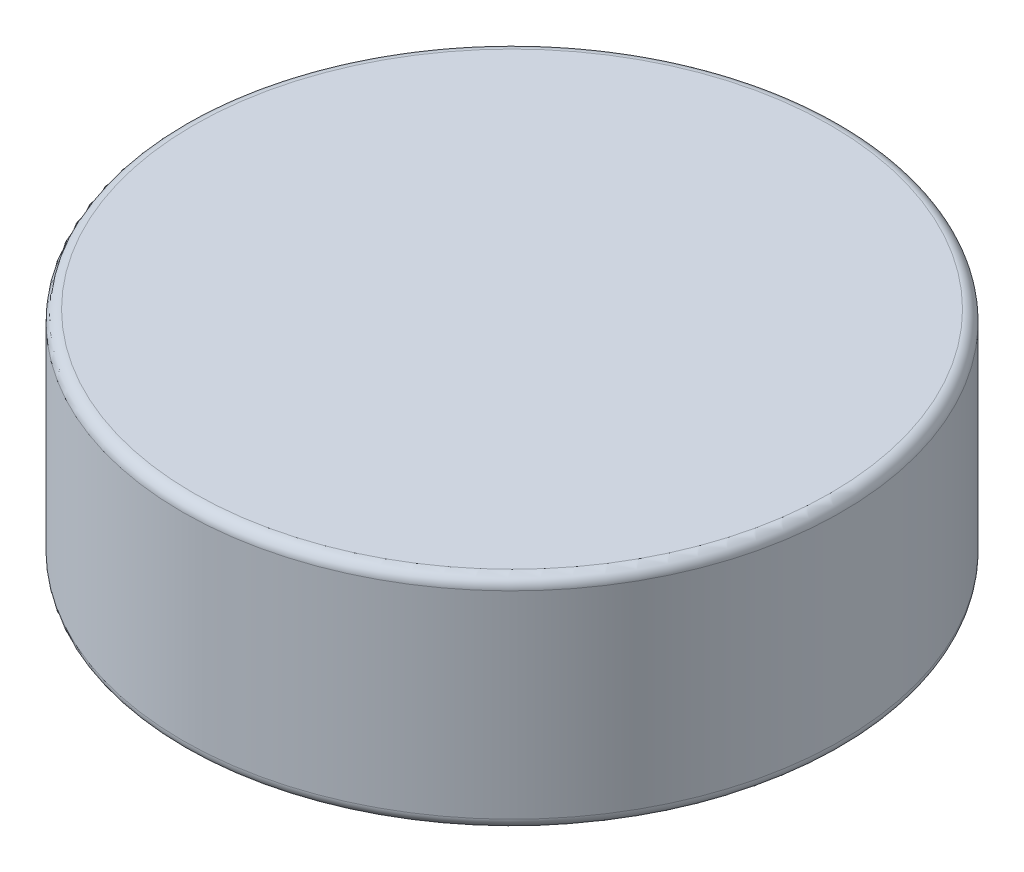
ISO-10303-21;
HEADER;
FILE_DESCRIPTION(('STEP AP214'),'2;1');
FILE_NAME('part.step','',(''),(''),'','','');
FILE_SCHEMA(('AUTOMOTIVE_DESIGN { 1 0 10303 214 1 1 1 1 }'));
ENDSEC;
DATA;
#1=APPLICATION_CONTEXT('core data for automotive mechanical design processes');
#2=APPLICATION_PROTOCOL_DEFINITION('international standard','automotive_design',2000,#1);
#3=PRODUCT_CONTEXT('',#1,'mechanical');
#4=PRODUCT('Part','Part','',(#3));
#5=PRODUCT_RELATED_PRODUCT_CATEGORY('part','',(#4));
#6=PRODUCT_DEFINITION_FORMATION('','',#4);
#7=PRODUCT_DEFINITION_CONTEXT('part definition',#1,'design');
#8=PRODUCT_DEFINITION('design','',#6,#7);
#9=PRODUCT_DEFINITION_SHAPE('','',#8);
#10=(LENGTH_UNIT() NAMED_UNIT(*) SI_UNIT(.MILLI.,.METRE.));
#11=(NAMED_UNIT(*) PLANE_ANGLE_UNIT() SI_UNIT($,.RADIAN.));
#12=(NAMED_UNIT(*) SI_UNIT($,.STERADIAN.) SOLID_ANGLE_UNIT());
#13=UNCERTAINTY_MEASURE_WITH_UNIT(LENGTH_MEASURE(1.E-05),#10,'distance_accuracy_value','');
#14=(GEOMETRIC_REPRESENTATION_CONTEXT(3) GLOBAL_UNCERTAINTY_ASSIGNED_CONTEXT((#13)) GLOBAL_UNIT_ASSIGNED_CONTEXT((#10,
#11,#12)) REPRESENTATION_CONTEXT('',''));
#15=CARTESIAN_POINT('',(0.,0.,0.));
#16=DIRECTION('',(0.,0.,1.));
#17=DIRECTION('',(1.,0.,0.));
#18=AXIS2_PLACEMENT_3D('',#15,#16,#17);
#19=CARTESIAN_POINT('',(0.,10.,0.));
#20=DIRECTION('',(0.,-1.,0.));
#21=DIRECTION('',(0.,0.,-1.));
#22=AXIS2_PLACEMENT_3D('',#19,#20,#21);
#23=CYLINDRICAL_SURFACE('',#22,15.);
#24=CARTESIAN_POINT('',(0.,0.5,0.));
#25=DIRECTION('',(0.,1.,0.));
#26=DIRECTION('',(0.,0.,1.));
#27=AXIS2_PLACEMENT_3D('',#24,#25,#26);
#28=CIRCLE('',#27,15.);
#29=CARTESIAN_POINT('',(0.,0.5,15.));
#30=VERTEX_POINT('',#29);
#31=EDGE_CURVE('E46',#30,#30,#28,.T.);
#32=ORIENTED_EDGE('',*,*,#31,.T.);
#33=EDGE_LOOP('',(#32));
#34=FACE_BOUND('',#33,.T.);
#35=CARTESIAN_POINT('',(0.,9.5,0.));
#36=DIRECTION('',(0.,1.,0.));
#37=DIRECTION('',(0.,0.,1.));
#38=AXIS2_PLACEMENT_3D('',#35,#36,#37);
#39=CIRCLE('',#38,15.);
#40=CARTESIAN_POINT('',(0.,9.5,15.));
#41=VERTEX_POINT('',#40);
#42=EDGE_CURVE('E50',#41,#41,#39,.F.);
#43=ORIENTED_EDGE('',*,*,#42,.T.);
#44=EDGE_LOOP('',(#43));
#45=FACE_BOUND('',#44,.T.);
#46=ADVANCED_FACE('F35',(#34,#45),#23,.T.);
#47=CARTESIAN_POINT('',(0.,10.,0.));
#48=DIRECTION('',(0.,1.,0.));
#49=DIRECTION('',(0.,0.,1.));
#50=AXIS2_PLACEMENT_3D('',#47,#48,#49);
#51=PLANE('',#50);
#52=CARTESIAN_POINT('',(0.,10.,0.));
#53=DIRECTION('',(0.,1.,0.));
#54=DIRECTION('',(0.,0.,1.));
#55=AXIS2_PLACEMENT_3D('',#52,#53,#54);
#56=CIRCLE('',#55,14.5);
#57=CARTESIAN_POINT('',(0.,10.,14.5));
#58=VERTEX_POINT('',#57);
#59=EDGE_CURVE('E10',#58,#58,#56,.T.);
#60=ORIENTED_EDGE('',*,*,#59,.T.);
#61=EDGE_LOOP('',(#60));
#62=FACE_BOUND('',#61,.T.);
#63=ADVANCED_FACE('F66',(#62),#51,.T.);
#64=CARTESIAN_POINT('',(0.,0.,0.));
#65=DIRECTION('',(0.,1.,0.));
#66=DIRECTION('',(0.,0.,1.));
#67=AXIS2_PLACEMENT_3D('',#64,#65,#66);
#68=PLANE('',#67);
#69=CARTESIAN_POINT('',(0.,0.,0.));
#70=DIRECTION('',(0.,1.,0.));
#71=DIRECTION('',(0.,0.,1.));
#72=AXIS2_PLACEMENT_3D('',#69,#70,#71);
#73=CIRCLE('',#72,14.5);
#74=CARTESIAN_POINT('',(0.,0.,14.5));
#75=VERTEX_POINT('',#74);
#76=EDGE_CURVE('E42',#75,#75,#73,.F.);
#77=ORIENTED_EDGE('',*,*,#76,.T.);
#78=EDGE_LOOP('',(#77));
#79=FACE_BOUND('',#78,.T.);
#80=ADVANCED_FACE('F63',(#79),#68,.F.);
#81=CARTESIAN_POINT('',(0.,0.5,0.));
#82=DIRECTION('',(0.,1.,0.));
#83=DIRECTION('',(0.,0.,1.));
#84=AXIS2_PLACEMENT_3D('',#81,#82,#83);
#85=TOROIDAL_SURFACE('',#84,14.5,0.5);
#86=ORIENTED_EDGE('',*,*,#76,.F.);
#87=EDGE_LOOP('',(#86));
#88=FACE_BOUND('',#87,.T.);
#89=ORIENTED_EDGE('',*,*,#31,.F.);
#90=EDGE_LOOP('',(#89));
#91=FACE_BOUND('',#90,.T.);
#92=ADVANCED_FACE('F59',(#88,#91),#85,.T.);
#93=CARTESIAN_POINT('',(0.,9.5,0.));
#94=DIRECTION('',(0.,1.,0.));
#95=DIRECTION('',(0.,0.,1.));
#96=AXIS2_PLACEMENT_3D('',#93,#94,#95);
#97=TOROIDAL_SURFACE('',#96,14.5,0.5);
#98=ORIENTED_EDGE('',*,*,#42,.F.);
#99=EDGE_LOOP('',(#98));
#100=FACE_BOUND('',#99,.T.);
#101=ORIENTED_EDGE('',*,*,#59,.F.);
#102=EDGE_LOOP('',(#101));
#103=FACE_BOUND('',#102,.T.);
#104=ADVANCED_FACE('F37',(#100,#103),#97,.T.);
#105=CLOSED_SHELL('',(#46,#63,#80,#92,#104));
#106=MANIFOLD_SOLID_BREP('B2',#105);
#107=ADVANCED_BREP_SHAPE_REPRESENTATION('',(#18,#106),#14);
#108=SHAPE_DEFINITION_REPRESENTATION(#9,#107);
ENDSEC;
END-ISO-10303-21;
